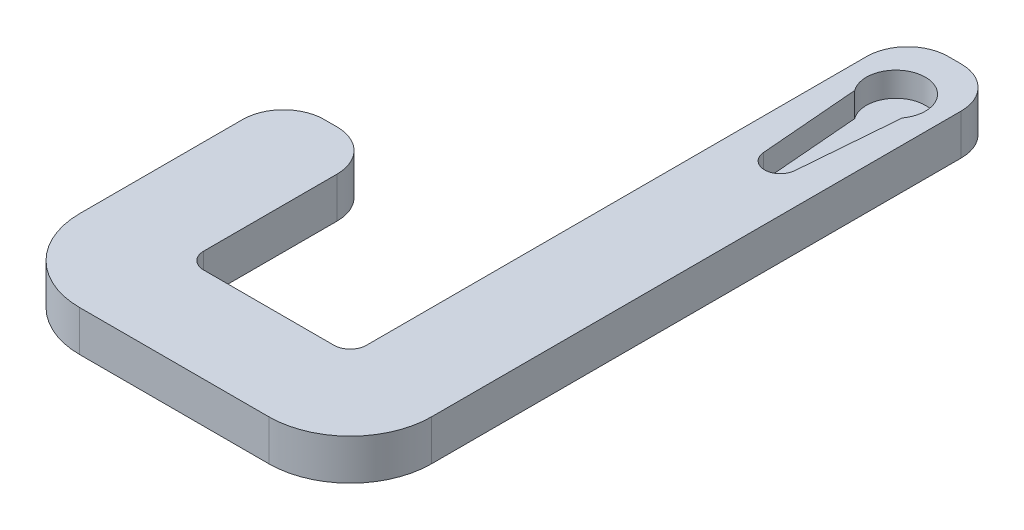
ISO-10303-21;
HEADER;
FILE_DESCRIPTION(('STEP AP214'),'2;1');
FILE_NAME('part.step','',(''),(''),'','','');
FILE_SCHEMA(('AUTOMOTIVE_DESIGN { 1 0 10303 214 1 1 1 1 }'));
ENDSEC;
DATA;
#1=APPLICATION_CONTEXT('core data for automotive mechanical design processes');
#2=APPLICATION_PROTOCOL_DEFINITION('international standard','automotive_design',2000,#1);
#3=PRODUCT_CONTEXT('',#1,'mechanical');
#4=PRODUCT('Part','Part','',(#3));
#5=PRODUCT_RELATED_PRODUCT_CATEGORY('part','',(#4));
#6=PRODUCT_DEFINITION_FORMATION('','',#4);
#7=PRODUCT_DEFINITION_CONTEXT('part definition',#1,'design');
#8=PRODUCT_DEFINITION('design','',#6,#7);
#9=PRODUCT_DEFINITION_SHAPE('','',#8);
#10=(LENGTH_UNIT() NAMED_UNIT(*) SI_UNIT(.MILLI.,.METRE.));
#11=(NAMED_UNIT(*) PLANE_ANGLE_UNIT() SI_UNIT($,.RADIAN.));
#12=(NAMED_UNIT(*) SI_UNIT($,.STERADIAN.) SOLID_ANGLE_UNIT());
#13=UNCERTAINTY_MEASURE_WITH_UNIT(LENGTH_MEASURE(1.E-05),#10,'distance_accuracy_value','');
#14=(GEOMETRIC_REPRESENTATION_CONTEXT(3) GLOBAL_UNCERTAINTY_ASSIGNED_CONTEXT((#13)) GLOBAL_UNIT_ASSIGNED_CONTEXT((#10,
#11,#12)) REPRESENTATION_CONTEXT('',''));
#15=CARTESIAN_POINT('',(0.,0.,0.));
#16=DIRECTION('',(0.,0.,1.));
#17=DIRECTION('',(1.,0.,0.));
#18=AXIS2_PLACEMENT_3D('',#15,#16,#17);
#19=CARTESIAN_POINT('',(20.,5.,-74.2));
#20=DIRECTION('',(0.,0.,1.));
#21=DIRECTION('',(1.,0.,0.));
#22=AXIS2_PLACEMENT_3D('',#19,#20,#21);
#23=PLANE('',#22);
#24=DIRECTION('',(-1.,0.,0.));
#25=VECTOR('',#24,1.);
#26=CARTESIAN_POINT('',(20.,0.,-74.2));
#27=LINE('',#26,#25);
#28=CARTESIAN_POINT('',(26.6,0.,-74.2));
#29=VERTEX_POINT('',#28);
#30=CARTESIAN_POINT('',(25.,0.,-74.2));
#31=VERTEX_POINT('',#30);
#32=EDGE_CURVE('E218',#29,#31,#27,.T.);
#33=ORIENTED_EDGE('',*,*,#32,.T.);
#34=DIRECTION('',(0.,-1.,0.));
#35=VECTOR('',#34,1.);
#36=CARTESIAN_POINT('',(25.,5.,-74.2));
#37=LINE('',#36,#35);
#38=CARTESIAN_POINT('',(25.,5.,-74.2));
#39=VERTEX_POINT('',#38);
#40=EDGE_CURVE('E272',#31,#39,#37,.F.);
#41=ORIENTED_EDGE('',*,*,#40,.T.);
#42=DIRECTION('',(-1.,0.,0.));
#43=VECTOR('',#42,1.);
#44=CARTESIAN_POINT('',(20.,5.,-74.2));
#45=LINE('',#44,#43);
#46=CARTESIAN_POINT('',(26.6,5.,-74.2));
#47=VERTEX_POINT('',#46);
#48=EDGE_CURVE('E224',#47,#39,#45,.T.);
#49=ORIENTED_EDGE('',*,*,#48,.F.);
#50=DIRECTION('',(0.,-1.,0.));
#51=VECTOR('',#50,1.);
#52=CARTESIAN_POINT('',(26.6,5.,-74.2));
#53=LINE('',#52,#51);
#54=EDGE_CURVE('E269',#47,#29,#53,.T.);
#55=ORIENTED_EDGE('',*,*,#54,.T.);
#56=EDGE_LOOP('',(#33,#41,#49,#55));
#57=FACE_BOUND('',#56,.T.);
#58=ADVANCED_FACE('F42',(#57),#23,.F.);
#59=CARTESIAN_POINT('',(20.,5.,-5.8));
#60=DIRECTION('',(1.,0.,0.));
#61=DIRECTION('',(0.,0.,-1.));
#62=AXIS2_PLACEMENT_3D('',#59,#60,#61);
#63=PLANE('',#62);
#64=DIRECTION('',(0.,0.,1.));
#65=VECTOR('',#64,1.);
#66=CARTESIAN_POINT('',(20.,0.,-5.8));
#67=LINE('',#66,#65);
#68=CARTESIAN_POINT('',(20.,0.,-69.2));
#69=VERTEX_POINT('',#68);
#70=CARTESIAN_POINT('',(20.,0.,-7.8));
#71=VERTEX_POINT('',#70);
#72=EDGE_CURVE('E246',#69,#71,#67,.T.);
#73=ORIENTED_EDGE('',*,*,#72,.T.);
#74=DIRECTION('',(0.,-1.,0.));
#75=VECTOR('',#74,1.);
#76=CARTESIAN_POINT('',(20.,5.,-7.8));
#77=LINE('',#76,#75);
#78=CARTESIAN_POINT('',(20.,5.,-7.8));
#79=VERTEX_POINT('',#78);
#80=EDGE_CURVE('E63',#71,#79,#77,.F.);
#81=ORIENTED_EDGE('',*,*,#80,.T.);
#82=DIRECTION('',(0.,0.,1.));
#83=VECTOR('',#82,1.);
#84=CARTESIAN_POINT('',(20.,5.,-5.8));
#85=LINE('',#84,#83);
#86=CARTESIAN_POINT('',(20.,5.,-69.2));
#87=VERTEX_POINT('',#86);
#88=EDGE_CURVE('E228',#87,#79,#85,.T.);
#89=ORIENTED_EDGE('',*,*,#88,.F.);
#90=DIRECTION('',(0.,-1.,0.));
#91=VECTOR('',#90,1.);
#92=CARTESIAN_POINT('',(20.,5.,-69.2));
#93=LINE('',#92,#91);
#94=EDGE_CURVE('E243',#87,#69,#93,.T.);
#95=ORIENTED_EDGE('',*,*,#94,.T.);
#96=EDGE_LOOP('',(#73,#81,#89,#95));
#97=FACE_BOUND('',#96,.T.);
#98=ADVANCED_FACE('F356',(#97),#63,.F.);
#99=CARTESIAN_POINT('',(0.,5.,-5.8));
#100=DIRECTION('',(0.,0.,1.));
#101=DIRECTION('',(1.,0.,0.));
#102=AXIS2_PLACEMENT_3D('',#99,#100,#101);
#103=PLANE('',#102);
#104=DIRECTION('',(-1.,0.,0.));
#105=VECTOR('',#104,1.);
#106=CARTESIAN_POINT('',(0.,0.,-5.8));
#107=LINE('',#106,#105);
#108=CARTESIAN_POINT('',(18.,0.,-5.8));
#109=VERTEX_POINT('',#108);
#110=CARTESIAN_POINT('',(2.,0.,-5.8));
#111=VERTEX_POINT('',#110);
#112=EDGE_CURVE('E248',#109,#111,#107,.T.);
#113=ORIENTED_EDGE('',*,*,#112,.T.);
#114=DIRECTION('',(0.,-1.,0.));
#115=VECTOR('',#114,1.);
#116=CARTESIAN_POINT('',(2.,5.,-5.8));
#117=LINE('',#116,#115);
#118=CARTESIAN_POINT('',(2.,5.,-5.8));
#119=VERTEX_POINT('',#118);
#120=EDGE_CURVE('E327',#111,#119,#117,.F.);
#121=ORIENTED_EDGE('',*,*,#120,.T.);
#122=DIRECTION('',(-1.,0.,0.));
#123=VECTOR('',#122,1.);
#124=CARTESIAN_POINT('',(0.,5.,-5.8));
#125=LINE('',#124,#123);
#126=CARTESIAN_POINT('',(18.,5.,-5.8));
#127=VERTEX_POINT('',#126);
#128=EDGE_CURVE('E230',#127,#119,#125,.T.);
#129=ORIENTED_EDGE('',*,*,#128,.F.);
#130=DIRECTION('',(0.,-1.,0.));
#131=VECTOR('',#130,1.);
#132=CARTESIAN_POINT('',(18.,0.,-5.8));
#133=LINE('',#132,#131);
#134=EDGE_CURVE('E324',#127,#109,#133,.T.);
#135=ORIENTED_EDGE('',*,*,#134,.T.);
#136=EDGE_LOOP('',(#113,#121,#129,#135));
#137=FACE_BOUND('',#136,.T.);
#138=ADVANCED_FACE('F350',(#137),#103,.F.);
#139=CARTESIAN_POINT('',(0.,5.,-5.8));
#140=DIRECTION('',(-1.,0.,0.));
#141=DIRECTION('',(0.,0.,1.));
#142=AXIS2_PLACEMENT_3D('',#139,#140,#141);
#143=PLANE('',#142);
#144=DIRECTION('',(0.,0.,-1.));
#145=VECTOR('',#144,1.);
#146=CARTESIAN_POINT('',(0.,5.,-5.8));
#147=LINE('',#146,#145);
#148=CARTESIAN_POINT('',(0.,5.,-7.8));
#149=VERTEX_POINT('',#148);
#150=CARTESIAN_POINT('',(0.,5.,-24.2));
#151=VERTEX_POINT('',#150);
#152=EDGE_CURVE('E233',#149,#151,#147,.T.);
#153=ORIENTED_EDGE('',*,*,#152,.F.);
#154=DIRECTION('',(0.,-1.,0.));
#155=VECTOR('',#154,1.);
#156=CARTESIAN_POINT('',(0.,0.,-7.8));
#157=LINE('',#156,#155);
#158=CARTESIAN_POINT('',(0.,0.,-7.8));
#159=VERTEX_POINT('',#158);
#160=EDGE_CURVE('E321',#149,#159,#157,.T.);
#161=ORIENTED_EDGE('',*,*,#160,.T.);
#162=DIRECTION('',(0.,0.,-1.));
#163=VECTOR('',#162,1.);
#164=CARTESIAN_POINT('',(0.,0.,-5.8));
#165=LINE('',#164,#163);
#166=CARTESIAN_POINT('',(0.,0.,-24.2));
#167=VERTEX_POINT('',#166);
#168=EDGE_CURVE('E251',#159,#167,#165,.T.);
#169=ORIENTED_EDGE('',*,*,#168,.T.);
#170=DIRECTION('',(0.,-1.,0.));
#171=VECTOR('',#170,1.);
#172=CARTESIAN_POINT('',(0.,5.,-24.2));
#173=LINE('',#172,#171);
#174=EDGE_CURVE('E311',#167,#151,#173,.F.);
#175=ORIENTED_EDGE('',*,*,#174,.T.);
#176=EDGE_LOOP('',(#153,#161,#169,#175));
#177=FACE_BOUND('',#176,.T.);
#178=ADVANCED_FACE('F342',(#177),#143,.F.);
#179=CARTESIAN_POINT('',(0.,5.,-29.2));
#180=DIRECTION('',(0.,0.,1.));
#181=DIRECTION('',(1.,0.,0.));
#182=AXIS2_PLACEMENT_3D('',#179,#180,#181);
#183=PLANE('',#182);
#184=DIRECTION('',(-1.,0.,0.));
#185=VECTOR('',#184,1.);
#186=CARTESIAN_POINT('',(0.,5.,-29.2));
#187=LINE('',#186,#185);
#188=CARTESIAN_POINT('',(-5.,5.,-29.2));
#189=VERTEX_POINT('',#188);
#190=CARTESIAN_POINT('',(-6.6,5.,-29.2));
#191=VERTEX_POINT('',#190);
#192=EDGE_CURVE('E235',#189,#191,#187,.T.);
#193=ORIENTED_EDGE('',*,*,#192,.F.);
#194=DIRECTION('',(0.,-1.,0.));
#195=VECTOR('',#194,1.);
#196=CARTESIAN_POINT('',(-5.,5.,-29.2));
#197=LINE('',#196,#195);
#198=CARTESIAN_POINT('',(-5.,0.,-29.2));
#199=VERTEX_POINT('',#198);
#200=EDGE_CURVE('E303',#189,#199,#197,.T.);
#201=ORIENTED_EDGE('',*,*,#200,.T.);
#202=DIRECTION('',(-1.,0.,0.));
#203=VECTOR('',#202,1.);
#204=CARTESIAN_POINT('',(0.,0.,-29.2));
#205=LINE('',#204,#203);
#206=CARTESIAN_POINT('',(-6.6,0.,-29.2));
#207=VERTEX_POINT('',#206);
#208=EDGE_CURVE('E253',#199,#207,#205,.T.);
#209=ORIENTED_EDGE('',*,*,#208,.T.);
#210=DIRECTION('',(0.,-1.,0.));
#211=VECTOR('',#210,1.);
#212=CARTESIAN_POINT('',(-6.6,5.,-29.2));
#213=LINE('',#212,#211);
#214=EDGE_CURVE('E301',#207,#191,#213,.F.);
#215=ORIENTED_EDGE('',*,*,#214,.T.);
#216=EDGE_LOOP('',(#193,#201,#209,#215));
#217=FACE_BOUND('',#216,.T.);
#218=ADVANCED_FACE('F397',(#217),#183,.F.);
#219=CARTESIAN_POINT('',(-11.6,5.,5.80000000000001));
#220=DIRECTION('',(1.,0.,0.));
#221=DIRECTION('',(0.,0.,-1.));
#222=AXIS2_PLACEMENT_3D('',#219,#220,#221);
#223=PLANE('',#222);
#224=DIRECTION('',(0.,0.,1.));
#225=VECTOR('',#224,1.);
#226=CARTESIAN_POINT('',(-11.6,5.,5.80000000000001));
#227=LINE('',#226,#225);
#228=CARTESIAN_POINT('',(-11.6,5.,-24.2));
#229=VERTEX_POINT('',#228);
#230=CARTESIAN_POINT('',(-11.6,5.,-4.19999999999999));
#231=VERTEX_POINT('',#230);
#232=EDGE_CURVE('E238',#229,#231,#227,.T.);
#233=ORIENTED_EDGE('',*,*,#232,.F.);
#234=DIRECTION('',(0.,-1.,0.));
#235=VECTOR('',#234,1.);
#236=CARTESIAN_POINT('',(-11.6,5.,-24.2));
#237=LINE('',#236,#235);
#238=CARTESIAN_POINT('',(-11.6,0.,-24.2));
#239=VERTEX_POINT('',#238);
#240=EDGE_CURVE('E318',#229,#239,#237,.T.);
#241=ORIENTED_EDGE('',*,*,#240,.T.);
#242=DIRECTION('',(0.,0.,1.));
#243=VECTOR('',#242,1.);
#244=CARTESIAN_POINT('',(-11.6,0.,5.80000000000001));
#245=LINE('',#244,#243);
#246=CARTESIAN_POINT('',(-11.6,0.,-4.19999999999999));
#247=VERTEX_POINT('',#246);
#248=EDGE_CURVE('E256',#239,#247,#245,.T.);
#249=ORIENTED_EDGE('',*,*,#248,.T.);
#250=DIRECTION('',(0.,-1.,0.));
#251=VECTOR('',#250,1.);
#252=CARTESIAN_POINT('',(-11.6,5.,-4.19999999999999));
#253=LINE('',#252,#251);
#254=EDGE_CURVE('E291',#247,#231,#253,.F.);
#255=ORIENTED_EDGE('',*,*,#254,.T.);
#256=EDGE_LOOP('',(#233,#241,#249,#255));
#257=FACE_BOUND('',#256,.T.);
#258=ADVANCED_FACE('F389',(#257),#223,.F.);
#259=CARTESIAN_POINT('',(31.6,5.,5.8));
#260=DIRECTION('',(0.,0.,-1.));
#261=DIRECTION('',(-1.,0.,0.));
#262=AXIS2_PLACEMENT_3D('',#259,#260,#261);
#263=PLANE('',#262);
#264=DIRECTION('',(1.,0.,0.));
#265=VECTOR('',#264,1.);
#266=CARTESIAN_POINT('',(0.,5.,5.8));
#267=LINE('',#266,#265);
#268=CARTESIAN_POINT('',(-1.59999999999999,5.,5.8));
#269=VERTEX_POINT('',#268);
#270=CARTESIAN_POINT('',(21.6,5.,5.8));
#271=VERTEX_POINT('',#270);
#272=EDGE_CURVE('E240',#269,#271,#267,.T.);
#273=ORIENTED_EDGE('',*,*,#272,.F.);
#274=DIRECTION('',(0.,-1.,0.));
#275=VECTOR('',#274,1.);
#276=CARTESIAN_POINT('',(-1.6,5.,5.80000000000001));
#277=LINE('',#276,#275);
#278=CARTESIAN_POINT('',(-1.6,0.,5.80000000000001));
#279=VERTEX_POINT('',#278);
#280=EDGE_CURVE('E283',#269,#279,#277,.T.);
#281=ORIENTED_EDGE('',*,*,#280,.T.);
#282=DIRECTION('',(1.,0.,0.));
#283=VECTOR('',#282,1.);
#284=CARTESIAN_POINT('',(31.6,0.,5.8));
#285=LINE('',#284,#283);
#286=CARTESIAN_POINT('',(21.6,0.,5.8));
#287=VERTEX_POINT('',#286);
#288=EDGE_CURVE('E258',#279,#287,#285,.T.);
#289=ORIENTED_EDGE('',*,*,#288,.T.);
#290=DIRECTION('',(0.,-1.,0.));
#291=VECTOR('',#290,1.);
#292=CARTESIAN_POINT('',(21.6,5.,5.8));
#293=LINE('',#292,#291);
#294=EDGE_CURVE('E281',#287,#271,#293,.F.);
#295=ORIENTED_EDGE('',*,*,#294,.T.);
#296=EDGE_LOOP('',(#273,#281,#289,#295));
#297=FACE_BOUND('',#296,.T.);
#298=ADVANCED_FACE('F380',(#297),#263,.F.);
#299=CARTESIAN_POINT('',(31.6,5.,5.8));
#300=DIRECTION('',(-1.,0.,0.));
#301=DIRECTION('',(0.,0.,1.));
#302=AXIS2_PLACEMENT_3D('',#299,#300,#301);
#303=PLANE('',#302);
#304=DIRECTION('',(0.,0.,-1.));
#305=VECTOR('',#304,1.);
#306=CARTESIAN_POINT('',(31.6,5.,-5.8));
#307=LINE('',#306,#305);
#308=CARTESIAN_POINT('',(31.6,5.,-4.2));
#309=VERTEX_POINT('',#308);
#310=CARTESIAN_POINT('',(31.6,5.,-69.2));
#311=VERTEX_POINT('',#310);
#312=EDGE_CURVE('E222',#309,#311,#307,.T.);
#313=ORIENTED_EDGE('',*,*,#312,.F.);
#314=DIRECTION('',(0.,-1.,0.));
#315=VECTOR('',#314,1.);
#316=CARTESIAN_POINT('',(31.6,5.,-4.2));
#317=LINE('',#316,#315);
#318=CARTESIAN_POINT('',(31.6,0.,-4.2));
#319=VERTEX_POINT('',#318);
#320=EDGE_CURVE('E298',#309,#319,#317,.T.);
#321=ORIENTED_EDGE('',*,*,#320,.T.);
#322=DIRECTION('',(0.,0.,-1.));
#323=VECTOR('',#322,1.);
#324=CARTESIAN_POINT('',(31.6,0.,5.8));
#325=LINE('',#324,#323);
#326=CARTESIAN_POINT('',(31.6,0.,-69.2));
#327=VERTEX_POINT('',#326);
#328=EDGE_CURVE('E225',#319,#327,#325,.T.);
#329=ORIENTED_EDGE('',*,*,#328,.T.);
#330=DIRECTION('',(0.,-1.,0.));
#331=VECTOR('',#330,1.);
#332=CARTESIAN_POINT('',(31.6,5.,-69.2));
#333=LINE('',#332,#331);
#334=EDGE_CURVE('E278',#327,#311,#333,.F.);
#335=ORIENTED_EDGE('',*,*,#334,.T.);
#336=EDGE_LOOP('',(#313,#321,#329,#335));
#337=FACE_BOUND('',#336,.T.);
#338=ADVANCED_FACE('F372',(#337),#303,.F.);
#339=CARTESIAN_POINT('',(0.,5.,0.));
#340=DIRECTION('',(0.,-1.,0.));
#341=DIRECTION('',(0.,0.,-1.));
#342=AXIS2_PLACEMENT_3D('',#339,#340,#341);
#343=PLANE('',#342);
#344=DIRECTION('',(0.0814505215145919,0.,0.996677386391906));
#345=VECTOR('',#344,1.);
#346=CARTESIAN_POINT('',(22.879,5.,-64.841739258182));
#347=LINE('',#346,#345);
#348=CARTESIAN_POINT('',(22.879,5.,-64.841739258182));
#349=VERTEX_POINT('',#348);
#350=CARTESIAN_POINT('',(23.8764126442636,5.,-52.6368004934768));
#351=VERTEX_POINT('',#350);
#352=EDGE_CURVE('E212',#349,#351,#347,.T.);
#353=ORIENTED_EDGE('',*,*,#352,.F.);
#354=CARTESIAN_POINT('',(25.8,5.,-66.98));
#355=DIRECTION('',(0.,1.,0.));
#356=DIRECTION('',(0.,0.,1.));
#357=AXIS2_PLACEMENT_3D('',#354,#355,#356);
#358=CIRCLE('',#357,3.62);
#359=CARTESIAN_POINT('',(28.721,5.,-64.841739258182));
#360=VERTEX_POINT('',#359);
#361=EDGE_CURVE('E186',#360,#349,#358,.T.);
#362=ORIENTED_EDGE('',*,*,#361,.F.);
#363=DIRECTION('',(0.0814505215145919,0.,-0.996677386391906));
#364=VECTOR('',#363,1.);
#365=CARTESIAN_POINT('',(28.721,5.,-64.841739258182));
#366=LINE('',#365,#364);
#367=CARTESIAN_POINT('',(27.7235873557364,5.,-52.6368004934768));
#368=VERTEX_POINT('',#367);
#369=EDGE_CURVE('E203',#368,#360,#366,.T.);
#370=ORIENTED_EDGE('',*,*,#369,.F.);
#371=CARTESIAN_POINT('',(25.8,5.,-52.794));
#372=DIRECTION('',(0.,1.,0.));
#373=DIRECTION('',(0.,0.,-1.));
#374=AXIS2_PLACEMENT_3D('',#371,#372,#373);
#375=CIRCLE('',#374,1.93);
#376=EDGE_CURVE('E206',#351,#368,#375,.T.);
#377=ORIENTED_EDGE('',*,*,#376,.F.);
#378=EDGE_LOOP('',(#353,#362,#370,#377));
#379=FACE_BOUND('',#378,.T.);
#380=ORIENTED_EDGE('',*,*,#128,.T.);
#381=CARTESIAN_POINT('',(2.,5.,-7.8));
#382=DIRECTION('',(0.,-1.,0.));
#383=DIRECTION('',(0.,0.,-1.));
#384=AXIS2_PLACEMENT_3D('',#381,#382,#383);
#385=CIRCLE('',#384,2.);
#386=EDGE_CURVE('E332',#119,#149,#385,.T.);
#387=ORIENTED_EDGE('',*,*,#386,.T.);
#388=ORIENTED_EDGE('',*,*,#152,.T.);
#389=CARTESIAN_POINT('',(-5.,5.,-24.2));
#390=DIRECTION('',(0.,-1.,0.));
#391=DIRECTION('',(0.,0.,-1.));
#392=AXIS2_PLACEMENT_3D('',#389,#390,#391);
#393=CIRCLE('',#392,5.);
#394=EDGE_CURVE('E316',#151,#189,#393,.F.);
#395=ORIENTED_EDGE('',*,*,#394,.T.);
#396=ORIENTED_EDGE('',*,*,#192,.T.);
#397=CARTESIAN_POINT('',(-6.6,5.,-24.2));
#398=DIRECTION('',(0.,-1.,0.));
#399=DIRECTION('',(0.,0.,-1.));
#400=AXIS2_PLACEMENT_3D('',#397,#398,#399);
#401=CIRCLE('',#400,5.);
#402=EDGE_CURVE('E314',#191,#229,#401,.F.);
#403=ORIENTED_EDGE('',*,*,#402,.T.);
#404=ORIENTED_EDGE('',*,*,#232,.T.);
#405=CARTESIAN_POINT('',(-1.6,5.,-4.19999999999999));
#406=DIRECTION('',(0.,-1.,0.));
#407=DIRECTION('',(0.,0.,-1.));
#408=AXIS2_PLACEMENT_3D('',#405,#406,#407);
#409=CIRCLE('',#408,10.);
#410=EDGE_CURVE('E296',#231,#269,#409,.F.);
#411=ORIENTED_EDGE('',*,*,#410,.T.);
#412=ORIENTED_EDGE('',*,*,#272,.T.);
#413=CARTESIAN_POINT('',(21.6,5.,-4.2));
#414=DIRECTION('',(0.,-1.,0.));
#415=DIRECTION('',(0.,0.,-1.));
#416=AXIS2_PLACEMENT_3D('',#413,#414,#415);
#417=CIRCLE('',#416,10.);
#418=EDGE_CURVE('E294',#271,#309,#417,.F.);
#419=ORIENTED_EDGE('',*,*,#418,.T.);
#420=ORIENTED_EDGE('',*,*,#312,.T.);
#421=CARTESIAN_POINT('',(26.6,5.,-69.2));
#422=DIRECTION('',(0.,-1.,0.));
#423=DIRECTION('',(0.,0.,-1.));
#424=AXIS2_PLACEMENT_3D('',#421,#422,#423);
#425=CIRCLE('',#424,5.);
#426=EDGE_CURVE('E274',#311,#47,#425,.F.);
#427=ORIENTED_EDGE('',*,*,#426,.T.);
#428=ORIENTED_EDGE('',*,*,#48,.T.);
#429=CARTESIAN_POINT('',(25.,5.,-69.2));
#430=DIRECTION('',(0.,-1.,0.));
#431=DIRECTION('',(0.,0.,-1.));
#432=AXIS2_PLACEMENT_3D('',#429,#430,#431);
#433=CIRCLE('',#432,5.);
#434=EDGE_CURVE('E276',#39,#87,#433,.F.);
#435=ORIENTED_EDGE('',*,*,#434,.T.);
#436=ORIENTED_EDGE('',*,*,#88,.T.);
#437=CARTESIAN_POINT('',(18.,5.,-7.8));
#438=DIRECTION('',(0.,-1.,0.));
#439=DIRECTION('',(0.,0.,-1.));
#440=AXIS2_PLACEMENT_3D('',#437,#438,#439);
#441=CIRCLE('',#440,2.);
#442=EDGE_CURVE('E12',#79,#127,#441,.T.);
#443=ORIENTED_EDGE('',*,*,#442,.T.);
#444=EDGE_LOOP('',(#380,#387,#388,#395,#396,#403,#404,#411,#412,#419,#420,#427,#428,#435,#436,#443));
#445=FACE_BOUND('',#444,.T.);
#446=ADVANCED_FACE('F336',(#379,#445),#343,.F.);
#447=CARTESIAN_POINT('',(0.,0.,0.));
#448=DIRECTION('',(0.,-1.,0.));
#449=DIRECTION('',(0.,0.,-1.));
#450=AXIS2_PLACEMENT_3D('',#447,#448,#449);
#451=PLANE('',#450);
#452=ORIENTED_EDGE('',*,*,#208,.F.);
#453=CARTESIAN_POINT('',(-5.,0.,-24.2));
#454=DIRECTION('',(0.,-1.,0.));
#455=DIRECTION('',(0.,0.,-1.));
#456=AXIS2_PLACEMENT_3D('',#453,#454,#455);
#457=CIRCLE('',#456,5.);
#458=EDGE_CURVE('E308',#199,#167,#457,.T.);
#459=ORIENTED_EDGE('',*,*,#458,.T.);
#460=ORIENTED_EDGE('',*,*,#168,.F.);
#461=CARTESIAN_POINT('',(2.,0.,-7.8));
#462=DIRECTION('',(0.,-1.,0.));
#463=DIRECTION('',(0.,0.,-1.));
#464=AXIS2_PLACEMENT_3D('',#461,#462,#463);
#465=CIRCLE('',#464,2.);
#466=EDGE_CURVE('E330',#159,#111,#465,.F.);
#467=ORIENTED_EDGE('',*,*,#466,.T.);
#468=ORIENTED_EDGE('',*,*,#112,.F.);
#469=CARTESIAN_POINT('',(18.,0.,-7.8));
#470=DIRECTION('',(0.,-1.,0.));
#471=DIRECTION('',(0.,0.,-1.));
#472=AXIS2_PLACEMENT_3D('',#469,#470,#471);
#473=CIRCLE('',#472,2.);
#474=EDGE_CURVE('E50',#109,#71,#473,.F.);
#475=ORIENTED_EDGE('',*,*,#474,.T.);
#476=ORIENTED_EDGE('',*,*,#72,.F.);
#477=CARTESIAN_POINT('',(25.,0.,-69.2));
#478=DIRECTION('',(0.,-1.,0.));
#479=DIRECTION('',(0.,0.,-1.));
#480=AXIS2_PLACEMENT_3D('',#477,#478,#479);
#481=CIRCLE('',#480,5.);
#482=EDGE_CURVE('E267',#69,#31,#481,.T.);
#483=ORIENTED_EDGE('',*,*,#482,.T.);
#484=ORIENTED_EDGE('',*,*,#32,.F.);
#485=CARTESIAN_POINT('',(26.6,0.,-69.2));
#486=DIRECTION('',(0.,-1.,0.));
#487=DIRECTION('',(0.,0.,-1.));
#488=AXIS2_PLACEMENT_3D('',#485,#486,#487);
#489=CIRCLE('',#488,5.);
#490=EDGE_CURVE('E264',#29,#327,#489,.T.);
#491=ORIENTED_EDGE('',*,*,#490,.T.);
#492=ORIENTED_EDGE('',*,*,#328,.F.);
#493=CARTESIAN_POINT('',(21.6,0.,-4.2));
#494=DIRECTION('',(0.,-1.,0.));
#495=DIRECTION('',(0.,0.,-1.));
#496=AXIS2_PLACEMENT_3D('',#493,#494,#495);
#497=CIRCLE('',#496,10.);
#498=EDGE_CURVE('E286',#319,#287,#497,.T.);
#499=ORIENTED_EDGE('',*,*,#498,.T.);
#500=ORIENTED_EDGE('',*,*,#288,.F.);
#501=CARTESIAN_POINT('',(-1.6,0.,-4.19999999999999));
#502=DIRECTION('',(0.,-1.,0.));
#503=DIRECTION('',(0.,0.,-1.));
#504=AXIS2_PLACEMENT_3D('',#501,#502,#503);
#505=CIRCLE('',#504,10.);
#506=EDGE_CURVE('E288',#279,#247,#505,.T.);
#507=ORIENTED_EDGE('',*,*,#506,.T.);
#508=ORIENTED_EDGE('',*,*,#248,.F.);
#509=CARTESIAN_POINT('',(-6.6,0.,-24.2));
#510=DIRECTION('',(0.,-1.,0.));
#511=DIRECTION('',(0.,0.,-1.));
#512=AXIS2_PLACEMENT_3D('',#509,#510,#511);
#513=CIRCLE('',#512,5.);
#514=EDGE_CURVE('E306',#239,#207,#513,.T.);
#515=ORIENTED_EDGE('',*,*,#514,.T.);
#516=EDGE_LOOP('',(#452,#459,#460,#467,#468,#475,#476,#483,#484,#491,#492,#499,#500,#507,#508,#515));
#517=FACE_BOUND('',#516,.T.);
#518=ADVANCED_FACE('F348',(#517),#451,.T.);
#519=CARTESIAN_POINT('',(25.8,2.,-66.98));
#520=DIRECTION('',(0.,1.,0.));
#521=DIRECTION('',(0.,0.,1.));
#522=AXIS2_PLACEMENT_3D('',#519,#520,#521);
#523=CYLINDRICAL_SURFACE('',#522,3.62);
#524=ORIENTED_EDGE('',*,*,#361,.T.);
#525=DIRECTION('',(0.,1.,0.));
#526=VECTOR('',#525,1.);
#527=CARTESIAN_POINT('',(22.879,2.,-64.841739258182));
#528=LINE('',#527,#526);
#529=CARTESIAN_POINT('',(22.879,2.,-64.841739258182));
#530=VERTEX_POINT('',#529);
#531=EDGE_CURVE('E179',#530,#349,#528,.T.);
#532=ORIENTED_EDGE('',*,*,#531,.F.);
#533=CARTESIAN_POINT('',(25.8,2.,-66.98));
#534=DIRECTION('',(0.,1.,0.));
#535=DIRECTION('',(0.,0.,1.));
#536=AXIS2_PLACEMENT_3D('',#533,#534,#535);
#537=CIRCLE('',#536,3.62);
#538=CARTESIAN_POINT('',(28.721,2.,-64.841739258182));
#539=VERTEX_POINT('',#538);
#540=EDGE_CURVE('E183',#539,#530,#537,.T.);
#541=ORIENTED_EDGE('',*,*,#540,.F.);
#542=DIRECTION('',(0.,1.,0.));
#543=VECTOR('',#542,1.);
#544=CARTESIAN_POINT('',(28.721,2.,-64.841739258182));
#545=LINE('',#544,#543);
#546=EDGE_CURVE('E216',#539,#360,#545,.T.);
#547=ORIENTED_EDGE('',*,*,#546,.T.);
#548=EDGE_LOOP('',(#524,#532,#541,#547));
#549=FACE_BOUND('',#548,.T.);
#550=ADVANCED_FACE('F181',(#549),#523,.F.);
#551=CARTESIAN_POINT('',(28.721,2.,-64.841739258182));
#552=DIRECTION('',(0.996677386391906,0.,0.0814505215145919));
#553=DIRECTION('',(0.0814505215145919,0.,-0.996677386391906));
#554=AXIS2_PLACEMENT_3D('',#551,#552,#553);
#555=PLANE('',#554);
#556=ORIENTED_EDGE('',*,*,#369,.T.);
#557=ORIENTED_EDGE('',*,*,#546,.F.);
#558=DIRECTION('',(0.0814505215145919,0.,-0.996677386391906));
#559=VECTOR('',#558,1.);
#560=CARTESIAN_POINT('',(28.721,2.,-64.841739258182));
#561=LINE('',#560,#559);
#562=CARTESIAN_POINT('',(27.7235873557364,2.,-52.6368004934768));
#563=VERTEX_POINT('',#562);
#564=EDGE_CURVE('E191',#563,#539,#561,.T.);
#565=ORIENTED_EDGE('',*,*,#564,.F.);
#566=DIRECTION('',(0.,1.,0.));
#567=VECTOR('',#566,1.);
#568=CARTESIAN_POINT('',(27.7235873557364,2.,-52.6368004934768));
#569=LINE('',#568,#567);
#570=EDGE_CURVE('E219',#563,#368,#569,.T.);
#571=ORIENTED_EDGE('',*,*,#570,.T.);
#572=EDGE_LOOP('',(#556,#557,#565,#571));
#573=FACE_BOUND('',#572,.T.);
#574=ADVANCED_FACE('F523',(#573),#555,.F.);
#575=CARTESIAN_POINT('',(25.8,2.,-52.794));
#576=DIRECTION('',(0.,1.,0.));
#577=DIRECTION('',(0.,0.,1.));
#578=AXIS2_PLACEMENT_3D('',#575,#576,#577);
#579=CYLINDRICAL_SURFACE('',#578,1.93);
#580=ORIENTED_EDGE('',*,*,#376,.T.);
#581=ORIENTED_EDGE('',*,*,#570,.F.);
#582=CARTESIAN_POINT('',(25.8,2.,-52.794));
#583=DIRECTION('',(0.,1.,0.));
#584=DIRECTION('',(0.,0.,-1.));
#585=AXIS2_PLACEMENT_3D('',#582,#583,#584);
#586=CIRCLE('',#585,1.93);
#587=CARTESIAN_POINT('',(23.8764126442636,2.,-52.6368004934768));
#588=VERTEX_POINT('',#587);
#589=EDGE_CURVE('E199',#588,#563,#586,.T.);
#590=ORIENTED_EDGE('',*,*,#589,.F.);
#591=DIRECTION('',(0.,1.,0.));
#592=VECTOR('',#591,1.);
#593=CARTESIAN_POINT('',(23.8764126442636,2.,-52.6368004934768));
#594=LINE('',#593,#592);
#595=EDGE_CURVE('E190',#588,#351,#594,.T.);
#596=ORIENTED_EDGE('',*,*,#595,.T.);
#597=EDGE_LOOP('',(#580,#581,#590,#596));
#598=FACE_BOUND('',#597,.T.);
#599=ADVANCED_FACE('F529',(#598),#579,.F.);
#600=CARTESIAN_POINT('',(22.879,2.,-64.841739258182));
#601=DIRECTION('',(-0.996677386391906,0.,0.0814505215145919));
#602=DIRECTION('',(0.0814505215145919,0.,0.996677386391906));
#603=AXIS2_PLACEMENT_3D('',#600,#601,#602);
#604=PLANE('',#603);
#605=ORIENTED_EDGE('',*,*,#352,.T.);
#606=ORIENTED_EDGE('',*,*,#595,.F.);
#607=DIRECTION('',(0.0814505215145919,0.,0.996677386391906));
#608=VECTOR('',#607,1.);
#609=CARTESIAN_POINT('',(22.879,2.,-64.841739258182));
#610=LINE('',#609,#608);
#611=EDGE_CURVE('E194',#530,#588,#610,.T.);
#612=ORIENTED_EDGE('',*,*,#611,.F.);
#613=ORIENTED_EDGE('',*,*,#531,.T.);
#614=EDGE_LOOP('',(#605,#606,#612,#613));
#615=FACE_BOUND('',#614,.T.);
#616=ADVANCED_FACE('F195',(#615),#604,.F.);
#617=CARTESIAN_POINT('',(25.8,2.,-66.98));
#618=DIRECTION('',(0.,1.,0.));
#619=DIRECTION('',(0.,0.,1.));
#620=AXIS2_PLACEMENT_3D('',#617,#618,#619);
#621=PLANE('',#620);
#622=ORIENTED_EDGE('',*,*,#540,.T.);
#623=ORIENTED_EDGE('',*,*,#611,.T.);
#624=ORIENTED_EDGE('',*,*,#589,.T.);
#625=ORIENTED_EDGE('',*,*,#564,.T.);
#626=EDGE_LOOP('',(#622,#623,#624,#625));
#627=FACE_BOUND('',#626,.T.);
#628=ADVANCED_FACE('F201',(#627),#621,.T.);
#629=CARTESIAN_POINT('',(25.,5.,-69.2));
#630=DIRECTION('',(0.,-1.,0.));
#631=DIRECTION('',(0.,0.,-1.));
#632=AXIS2_PLACEMENT_3D('',#629,#630,#631);
#633=CYLINDRICAL_SURFACE('',#632,5.);
#634=ORIENTED_EDGE('',*,*,#434,.F.);
#635=ORIENTED_EDGE('',*,*,#40,.F.);
#636=ORIENTED_EDGE('',*,*,#482,.F.);
#637=ORIENTED_EDGE('',*,*,#94,.F.);
#638=EDGE_LOOP('',(#634,#635,#636,#637));
#639=FACE_BOUND('',#638,.T.);
#640=ADVANCED_FACE('F358',(#639),#633,.T.);
#641=CARTESIAN_POINT('',(26.6,5.,-69.2));
#642=DIRECTION('',(0.,-1.,0.));
#643=DIRECTION('',(0.,0.,-1.));
#644=AXIS2_PLACEMENT_3D('',#641,#642,#643);
#645=CYLINDRICAL_SURFACE('',#644,5.);
#646=ORIENTED_EDGE('',*,*,#426,.F.);
#647=ORIENTED_EDGE('',*,*,#334,.F.);
#648=ORIENTED_EDGE('',*,*,#490,.F.);
#649=ORIENTED_EDGE('',*,*,#54,.F.);
#650=EDGE_LOOP('',(#646,#647,#648,#649));
#651=FACE_BOUND('',#650,.T.);
#652=ADVANCED_FACE('F366',(#651),#645,.T.);
#653=CARTESIAN_POINT('',(-1.6,5.,-4.19999999999999));
#654=DIRECTION('',(0.,-1.,0.));
#655=DIRECTION('',(0.,0.,-1.));
#656=AXIS2_PLACEMENT_3D('',#653,#654,#655);
#657=CYLINDRICAL_SURFACE('',#656,10.);
#658=ORIENTED_EDGE('',*,*,#410,.F.);
#659=ORIENTED_EDGE('',*,*,#254,.F.);
#660=ORIENTED_EDGE('',*,*,#506,.F.);
#661=ORIENTED_EDGE('',*,*,#280,.F.);
#662=EDGE_LOOP('',(#658,#659,#660,#661));
#663=FACE_BOUND('',#662,.T.);
#664=ADVANCED_FACE('F386',(#663),#657,.T.);
#665=CARTESIAN_POINT('',(21.6,5.,-4.2));
#666=DIRECTION('',(0.,-1.,0.));
#667=DIRECTION('',(0.,0.,-1.));
#668=AXIS2_PLACEMENT_3D('',#665,#666,#667);
#669=CYLINDRICAL_SURFACE('',#668,10.);
#670=ORIENTED_EDGE('',*,*,#418,.F.);
#671=ORIENTED_EDGE('',*,*,#294,.F.);
#672=ORIENTED_EDGE('',*,*,#498,.F.);
#673=ORIENTED_EDGE('',*,*,#320,.F.);
#674=EDGE_LOOP('',(#670,#671,#672,#673));
#675=FACE_BOUND('',#674,.T.);
#676=ADVANCED_FACE('F376',(#675),#669,.T.);
#677=CARTESIAN_POINT('',(-5.,5.,-24.2));
#678=DIRECTION('',(0.,-1.,0.));
#679=DIRECTION('',(0.,0.,-1.));
#680=AXIS2_PLACEMENT_3D('',#677,#678,#679);
#681=CYLINDRICAL_SURFACE('',#680,5.);
#682=ORIENTED_EDGE('',*,*,#394,.F.);
#683=ORIENTED_EDGE('',*,*,#174,.F.);
#684=ORIENTED_EDGE('',*,*,#458,.F.);
#685=ORIENTED_EDGE('',*,*,#200,.F.);
#686=EDGE_LOOP('',(#682,#683,#684,#685));
#687=FACE_BOUND('',#686,.T.);
#688=ADVANCED_FACE('F400',(#687),#681,.T.);
#689=CARTESIAN_POINT('',(-6.6,5.,-24.2));
#690=DIRECTION('',(0.,-1.,0.));
#691=DIRECTION('',(0.,0.,-1.));
#692=AXIS2_PLACEMENT_3D('',#689,#690,#691);
#693=CYLINDRICAL_SURFACE('',#692,5.);
#694=ORIENTED_EDGE('',*,*,#402,.F.);
#695=ORIENTED_EDGE('',*,*,#214,.F.);
#696=ORIENTED_EDGE('',*,*,#514,.F.);
#697=ORIENTED_EDGE('',*,*,#240,.F.);
#698=EDGE_LOOP('',(#694,#695,#696,#697));
#699=FACE_BOUND('',#698,.T.);
#700=ADVANCED_FACE('F393',(#699),#693,.T.);
#701=CARTESIAN_POINT('',(2.,5.,-7.8));
#702=DIRECTION('',(0.,1.,0.));
#703=DIRECTION('',(0.,0.,1.));
#704=AXIS2_PLACEMENT_3D('',#701,#702,#703);
#705=CYLINDRICAL_SURFACE('',#704,2.);
#706=ORIENTED_EDGE('',*,*,#386,.F.);
#707=ORIENTED_EDGE('',*,*,#120,.F.);
#708=ORIENTED_EDGE('',*,*,#466,.F.);
#709=ORIENTED_EDGE('',*,*,#160,.F.);
#710=EDGE_LOOP('',(#706,#707,#708,#709));
#711=FACE_BOUND('',#710,.T.);
#712=ADVANCED_FACE('F346',(#711),#705,.F.);
#713=CARTESIAN_POINT('',(18.,5.,-7.8));
#714=DIRECTION('',(0.,1.,0.));
#715=DIRECTION('',(0.,0.,1.));
#716=AXIS2_PLACEMENT_3D('',#713,#714,#715);
#717=CYLINDRICAL_SURFACE('',#716,2.);
#718=ORIENTED_EDGE('',*,*,#442,.F.);
#719=ORIENTED_EDGE('',*,*,#80,.F.);
#720=ORIENTED_EDGE('',*,*,#474,.F.);
#721=ORIENTED_EDGE('',*,*,#134,.F.);
#722=EDGE_LOOP('',(#718,#719,#720,#721));
#723=FACE_BOUND('',#722,.T.);
#724=ADVANCED_FACE('F44',(#723),#717,.F.);
#725=CLOSED_SHELL('',(#58,#98,#138,#178,#218,#258,#298,#338,#446,#518,#550,#574,#599,#616,#628,
#640,#652,#664,#676,#688,#700,#712,#724));
#726=MANIFOLD_SOLID_BREP('B2',#725);
#727=ADVANCED_BREP_SHAPE_REPRESENTATION('',(#18,#726),#14);
#728=SHAPE_DEFINITION_REPRESENTATION(#9,#727);
ENDSEC;
END-ISO-10303-21;
